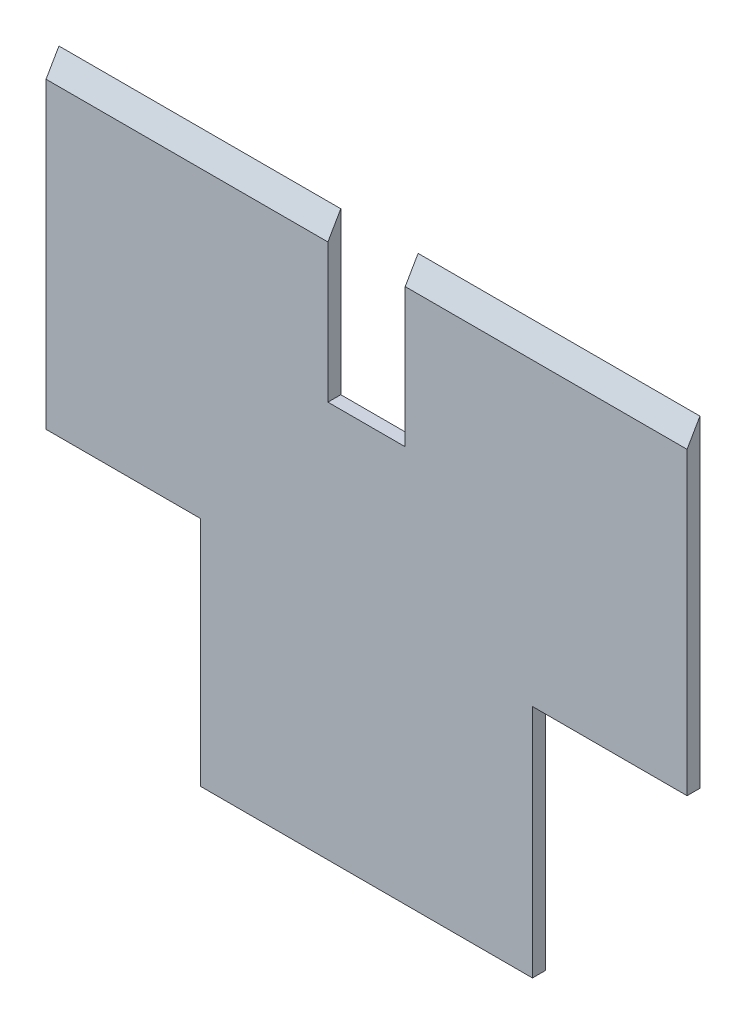
ISO-10303-21;
HEADER;
FILE_DESCRIPTION(('STEP AP214'),'2;1');
FILE_NAME('part.step','',(''),(''),'','','');
FILE_SCHEMA(('AUTOMOTIVE_DESIGN { 1 0 10303 214 1 1 1 1 }'));
ENDSEC;
DATA;
#1=APPLICATION_CONTEXT('core data for automotive mechanical design processes');
#2=APPLICATION_PROTOCOL_DEFINITION('international standard','automotive_design',2000,#1);
#3=PRODUCT_CONTEXT('',#1,'mechanical');
#4=PRODUCT('Part','Part','',(#3));
#5=PRODUCT_RELATED_PRODUCT_CATEGORY('part','',(#4));
#6=PRODUCT_DEFINITION_FORMATION('','',#4);
#7=PRODUCT_DEFINITION_CONTEXT('part definition',#1,'design');
#8=PRODUCT_DEFINITION('design','',#6,#7);
#9=PRODUCT_DEFINITION_SHAPE('','',#8);
#10=(LENGTH_UNIT() NAMED_UNIT(*) SI_UNIT(.MILLI.,.METRE.));
#11=(NAMED_UNIT(*) PLANE_ANGLE_UNIT() SI_UNIT($,.RADIAN.));
#12=(NAMED_UNIT(*) SI_UNIT($,.STERADIAN.) SOLID_ANGLE_UNIT());
#13=UNCERTAINTY_MEASURE_WITH_UNIT(LENGTH_MEASURE(1.E-05),#10,'distance_accuracy_value','');
#14=(GEOMETRIC_REPRESENTATION_CONTEXT(3) GLOBAL_UNCERTAINTY_ASSIGNED_CONTEXT((#13)) GLOBAL_UNIT_ASSIGNED_CONTEXT((#10,
#11,#12)) REPRESENTATION_CONTEXT('',''));
#15=CARTESIAN_POINT('',(0.,0.,0.));
#16=DIRECTION('',(0.,0.,1.));
#17=DIRECTION('',(1.,0.,0.));
#18=AXIS2_PLACEMENT_3D('',#15,#16,#17);
#19=CARTESIAN_POINT('',(100.,92.5322225306928,0.));
#20=DIRECTION('',(0.,-0.499722453506971,-0.866185586038566));
#21=DIRECTION('',(0.,0.866185586038566,-0.499722453506971));
#22=AXIS2_PLACEMENT_3D('',#19,#20,#21);
#23=PLANE('',#22);
#24=DIRECTION('',(-1.,0.,0.));
#25=VECTOR('',#24,1.);
#26=CARTESIAN_POINT('',(100.,89.065555864187,2.));
#27=LINE('',#26,#25);
#28=CARTESIAN_POINT('',(43.75,89.065555864187,2.));
#29=VERTEX_POINT('',#28);
#30=CARTESIAN_POINT('',(0.,89.065555864187,2.));
#31=VERTEX_POINT('',#30);
#32=EDGE_CURVE('E175',#29,#31,#27,.T.);
#33=ORIENTED_EDGE('',*,*,#32,.F.);
#34=DIRECTION('',(0.,0.866185586038566,-0.499722453506971));
#35=VECTOR('',#34,1.);
#36=CARTESIAN_POINT('',(43.75,92.5322225306928,0.));
#37=LINE('',#36,#35);
#38=CARTESIAN_POINT('',(43.75,92.5322225306928,0.));
#39=VERTEX_POINT('',#38);
#40=EDGE_CURVE('E11',#29,#39,#37,.T.);
#41=ORIENTED_EDGE('',*,*,#40,.T.);
#42=DIRECTION('',(-1.,0.,0.));
#43=VECTOR('',#42,1.);
#44=CARTESIAN_POINT('',(100.,92.5322225306928,0.));
#45=LINE('',#44,#43);
#46=CARTESIAN_POINT('',(0.,92.5322225306928,0.));
#47=VERTEX_POINT('',#46);
#48=EDGE_CURVE('E181',#39,#47,#45,.T.);
#49=ORIENTED_EDGE('',*,*,#48,.T.);
#50=DIRECTION('',(0.,-0.866185586038566,0.499722453506971));
#51=VECTOR('',#50,1.);
#52=CARTESIAN_POINT('',(0.,92.5322225306928,0.));
#53=LINE('',#52,#51);
#54=EDGE_CURVE('E179',#47,#31,#53,.T.);
#55=ORIENTED_EDGE('',*,*,#54,.T.);
#56=EDGE_LOOP('',(#33,#41,#49,#55));
#57=FACE_BOUND('',#56,.T.);
#58=ADVANCED_FACE('F32',(#57),#23,.F.);
#59=CARTESIAN_POINT('',(0.,42.,2.));
#60=DIRECTION('',(1.,0.,0.));
#61=DIRECTION('',(0.,0.,-1.));
#62=AXIS2_PLACEMENT_3D('',#59,#60,#61);
#63=PLANE('',#62);
#64=DIRECTION('',(0.,-1.,0.));
#65=VECTOR('',#64,1.);
#66=CARTESIAN_POINT('',(0.,42.,2.));
#67=LINE('',#66,#65);
#68=CARTESIAN_POINT('',(0.,42.,2.));
#69=VERTEX_POINT('',#68);
#70=EDGE_CURVE('E142',#31,#69,#67,.T.);
#71=ORIENTED_EDGE('',*,*,#70,.F.);
#72=ORIENTED_EDGE('',*,*,#54,.F.);
#73=DIRECTION('',(0.,-1.,0.));
#74=VECTOR('',#73,1.);
#75=CARTESIAN_POINT('',(0.,42.,0.));
#76=LINE('',#75,#74);
#77=CARTESIAN_POINT('',(0.,42.,0.));
#78=VERTEX_POINT('',#77);
#79=EDGE_CURVE('E147',#47,#78,#76,.T.);
#80=ORIENTED_EDGE('',*,*,#79,.T.);
#81=DIRECTION('',(0.,0.,-1.));
#82=VECTOR('',#81,1.);
#83=CARTESIAN_POINT('',(0.,42.,2.));
#84=LINE('',#83,#82);
#85=EDGE_CURVE('E152',#69,#78,#84,.T.);
#86=ORIENTED_EDGE('',*,*,#85,.F.);
#87=EDGE_LOOP('',(#71,#72,#80,#86));
#88=FACE_BOUND('',#87,.T.);
#89=ADVANCED_FACE('F34',(#88),#63,.F.);
#90=CARTESIAN_POINT('',(24.,42.,2.));
#91=DIRECTION('',(0.,1.,0.));
#92=DIRECTION('',(0.,0.,1.));
#93=AXIS2_PLACEMENT_3D('',#90,#91,#92);
#94=PLANE('',#93);
#95=DIRECTION('',(1.,0.,0.));
#96=VECTOR('',#95,1.);
#97=CARTESIAN_POINT('',(24.,42.,0.));
#98=LINE('',#97,#96);
#99=CARTESIAN_POINT('',(24.,42.,0.));
#100=VERTEX_POINT('',#99);
#101=EDGE_CURVE('E143',#78,#100,#98,.T.);
#102=ORIENTED_EDGE('',*,*,#101,.T.);
#103=DIRECTION('',(0.,0.,-1.));
#104=VECTOR('',#103,1.);
#105=CARTESIAN_POINT('',(24.,42.,2.));
#106=LINE('',#105,#104);
#107=CARTESIAN_POINT('',(24.,42.,2.));
#108=VERTEX_POINT('',#107);
#109=EDGE_CURVE('E141',#108,#100,#106,.T.);
#110=ORIENTED_EDGE('',*,*,#109,.F.);
#111=DIRECTION('',(1.,0.,0.));
#112=VECTOR('',#111,1.);
#113=CARTESIAN_POINT('',(24.,42.,2.));
#114=LINE('',#113,#112);
#115=EDGE_CURVE('E145',#69,#108,#114,.T.);
#116=ORIENTED_EDGE('',*,*,#115,.F.);
#117=ORIENTED_EDGE('',*,*,#85,.T.);
#118=EDGE_LOOP('',(#102,#110,#116,#117));
#119=FACE_BOUND('',#118,.T.);
#120=ADVANCED_FACE('F189',(#119),#94,.F.);
#121=CARTESIAN_POINT('',(24.,42.,2.));
#122=DIRECTION('',(1.,0.,0.));
#123=DIRECTION('',(0.,0.,-1.));
#124=AXIS2_PLACEMENT_3D('',#121,#122,#123);
#125=PLANE('',#124);
#126=DIRECTION('',(0.,-1.,0.));
#127=VECTOR('',#126,1.);
#128=CARTESIAN_POINT('',(24.,42.,0.));
#129=LINE('',#128,#127);
#130=CARTESIAN_POINT('',(24.,5.99999999999999,0.));
#131=VERTEX_POINT('',#130);
#132=EDGE_CURVE('E134',#100,#131,#129,.T.);
#133=ORIENTED_EDGE('',*,*,#132,.T.);
#134=DIRECTION('',(0.,0.,1.));
#135=VECTOR('',#134,1.);
#136=CARTESIAN_POINT('',(24.,5.99999999999999,0.));
#137=LINE('',#136,#135);
#138=CARTESIAN_POINT('',(24.,5.99999999999999,2.));
#139=VERTEX_POINT('',#138);
#140=EDGE_CURVE('E119',#131,#139,#137,.T.);
#141=ORIENTED_EDGE('',*,*,#140,.T.);
#142=DIRECTION('',(0.,-1.,0.));
#143=VECTOR('',#142,1.);
#144=CARTESIAN_POINT('',(24.,42.,2.));
#145=LINE('',#144,#143);
#146=EDGE_CURVE('E153',#108,#139,#145,.T.);
#147=ORIENTED_EDGE('',*,*,#146,.F.);
#148=ORIENTED_EDGE('',*,*,#109,.T.);
#149=EDGE_LOOP('',(#133,#141,#147,#148));
#150=FACE_BOUND('',#149,.T.);
#151=ADVANCED_FACE('F139',(#150),#125,.F.);
#152=CARTESIAN_POINT('',(0.,0.,2.));
#153=DIRECTION('',(0.,0.,-1.));
#154=DIRECTION('',(-1.,0.,0.));
#155=AXIS2_PLACEMENT_3D('',#152,#153,#154);
#156=PLANE('',#155);
#157=ORIENTED_EDGE('',*,*,#146,.T.);
#158=DIRECTION('',(1.,0.,0.));
#159=VECTOR('',#158,1.);
#160=CARTESIAN_POINT('',(24.,5.99999999999999,2.));
#161=LINE('',#160,#159);
#162=CARTESIAN_POINT('',(75.5028366048789,5.99999999999999,2.));
#163=VERTEX_POINT('',#162);
#164=EDGE_CURVE('E122',#139,#163,#161,.T.);
#165=ORIENTED_EDGE('',*,*,#164,.T.);
#166=DIRECTION('',(0.,1.,0.));
#167=VECTOR('',#166,1.);
#168=CARTESIAN_POINT('',(75.5028366048789,0.,2.));
#169=LINE('',#168,#167);
#170=CARTESIAN_POINT('',(75.5028366048789,42.5,2.));
#171=VERTEX_POINT('',#170);
#172=EDGE_CURVE('E207',#163,#171,#169,.T.);
#173=ORIENTED_EDGE('',*,*,#172,.T.);
#174=DIRECTION('',(1.,0.,0.));
#175=VECTOR('',#174,1.);
#176=CARTESIAN_POINT('',(75.5028366048789,42.5,2.));
#177=LINE('',#176,#175);
#178=CARTESIAN_POINT('',(99.5,42.5,2.));
#179=VERTEX_POINT('',#178);
#180=EDGE_CURVE('E213',#171,#179,#177,.T.);
#181=ORIENTED_EDGE('',*,*,#180,.T.);
#182=DIRECTION('',(0.,1.,0.));
#183=VECTOR('',#182,1.);
#184=CARTESIAN_POINT('',(99.5,92.5322225306928,2.));
#185=LINE('',#184,#183);
#186=CARTESIAN_POINT('',(99.5,89.065555864187,2.));
#187=VERTEX_POINT('',#186);
#188=EDGE_CURVE('E174',#179,#187,#185,.T.);
#189=ORIENTED_EDGE('',*,*,#188,.T.);
#190=CARTESIAN_POINT('',(55.75,89.065555864187,2.));
#191=VERTEX_POINT('',#190);
#192=EDGE_CURVE('E163',#187,#191,#27,.T.);
#193=ORIENTED_EDGE('',*,*,#192,.T.);
#194=DIRECTION('',(0.,-1.,0.));
#195=VECTOR('',#194,1.);
#196=CARTESIAN_POINT('',(55.75,67.5322225306928,2.));
#197=LINE('',#196,#195);
#198=CARTESIAN_POINT('',(55.75,67.5322225306928,2.));
#199=VERTEX_POINT('',#198);
#200=EDGE_CURVE('E55',#191,#199,#197,.T.);
#201=ORIENTED_EDGE('',*,*,#200,.T.);
#202=DIRECTION('',(-1.,0.,0.));
#203=VECTOR('',#202,1.);
#204=CARTESIAN_POINT('',(55.75,67.5322225306928,2.));
#205=LINE('',#204,#203);
#206=CARTESIAN_POINT('',(43.75,67.5322225306928,2.));
#207=VERTEX_POINT('',#206);
#208=EDGE_CURVE('E218',#199,#207,#205,.T.);
#209=ORIENTED_EDGE('',*,*,#208,.T.);
#210=DIRECTION('',(0.,1.,0.));
#211=VECTOR('',#210,1.);
#212=CARTESIAN_POINT('',(43.75,67.5322225306928,2.));
#213=LINE('',#212,#211);
#214=EDGE_CURVE('E223',#207,#29,#213,.T.);
#215=ORIENTED_EDGE('',*,*,#214,.T.);
#216=ORIENTED_EDGE('',*,*,#32,.T.);
#217=ORIENTED_EDGE('',*,*,#70,.T.);
#218=ORIENTED_EDGE('',*,*,#115,.T.);
#219=EDGE_LOOP('',(#157,#165,#173,#181,#189,#193,#201,#209,#215,#216,#217,#218));
#220=FACE_BOUND('',#219,.T.);
#221=ADVANCED_FACE('F170',(#220),#156,.F.);
#222=CARTESIAN_POINT('',(0.,0.,0.));
#223=DIRECTION('',(0.,0.,-1.));
#224=DIRECTION('',(-1.,0.,0.));
#225=AXIS2_PLACEMENT_3D('',#222,#223,#224);
#226=PLANE('',#225);
#227=DIRECTION('',(1.,0.,0.));
#228=VECTOR('',#227,1.);
#229=CARTESIAN_POINT('',(24.,5.99999999999999,0.));
#230=LINE('',#229,#228);
#231=CARTESIAN_POINT('',(75.5028366048789,5.99999999999999,0.));
#232=VERTEX_POINT('',#231);
#233=EDGE_CURVE('E47',#131,#232,#230,.T.);
#234=ORIENTED_EDGE('',*,*,#233,.F.);
#235=ORIENTED_EDGE('',*,*,#132,.F.);
#236=ORIENTED_EDGE('',*,*,#101,.F.);
#237=ORIENTED_EDGE('',*,*,#79,.F.);
#238=ORIENTED_EDGE('',*,*,#48,.F.);
#239=DIRECTION('',(0.,1.,0.));
#240=VECTOR('',#239,1.);
#241=CARTESIAN_POINT('',(43.75,67.5322225306928,0.));
#242=LINE('',#241,#240);
#243=CARTESIAN_POINT('',(43.75,67.5322225306928,0.));
#244=VERTEX_POINT('',#243);
#245=EDGE_CURVE('E226',#244,#39,#242,.T.);
#246=ORIENTED_EDGE('',*,*,#245,.F.);
#247=DIRECTION('',(-1.,0.,0.));
#248=VECTOR('',#247,1.);
#249=CARTESIAN_POINT('',(55.75,67.5322225306928,0.));
#250=LINE('',#249,#248);
#251=CARTESIAN_POINT('',(55.75,67.5322225306928,0.));
#252=VERTEX_POINT('',#251);
#253=EDGE_CURVE('E220',#252,#244,#250,.T.);
#254=ORIENTED_EDGE('',*,*,#253,.F.);
#255=DIRECTION('',(0.,-1.,0.));
#256=VECTOR('',#255,1.);
#257=CARTESIAN_POINT('',(55.75,67.5322225306928,0.));
#258=LINE('',#257,#256);
#259=CARTESIAN_POINT('',(55.75,92.5322225306928,0.));
#260=VERTEX_POINT('',#259);
#261=EDGE_CURVE('E224',#260,#252,#258,.T.);
#262=ORIENTED_EDGE('',*,*,#261,.F.);
#263=CARTESIAN_POINT('',(99.5,92.5322225306928,0.));
#264=VERTEX_POINT('',#263);
#265=EDGE_CURVE('E165',#264,#260,#45,.T.);
#266=ORIENTED_EDGE('',*,*,#265,.F.);
#267=DIRECTION('',(0.,1.,0.));
#268=VECTOR('',#267,1.);
#269=CARTESIAN_POINT('',(99.5,92.5322225306928,0.));
#270=LINE('',#269,#268);
#271=CARTESIAN_POINT('',(99.5,42.5,0.));
#272=VERTEX_POINT('',#271);
#273=EDGE_CURVE('E205',#272,#264,#270,.T.);
#274=ORIENTED_EDGE('',*,*,#273,.F.);
#275=DIRECTION('',(1.,0.,0.));
#276=VECTOR('',#275,1.);
#277=CARTESIAN_POINT('',(75.5028366048789,42.5,0.));
#278=LINE('',#277,#276);
#279=CARTESIAN_POINT('',(75.5028366048789,42.5,0.));
#280=VERTEX_POINT('',#279);
#281=EDGE_CURVE('E208',#280,#272,#278,.T.);
#282=ORIENTED_EDGE('',*,*,#281,.F.);
#283=DIRECTION('',(0.,1.,0.));
#284=VECTOR('',#283,1.);
#285=CARTESIAN_POINT('',(75.5028366048789,0.,0.));
#286=LINE('',#285,#284);
#287=EDGE_CURVE('E136',#232,#280,#286,.T.);
#288=ORIENTED_EDGE('',*,*,#287,.F.);
#289=EDGE_LOOP('',(#234,#235,#236,#237,#238,#246,#254,#262,#266,#274,#282,#288));
#290=FACE_BOUND('',#289,.T.);
#291=ADVANCED_FACE('F132',(#290),#226,.T.);
#292=ORIENTED_EDGE('',*,*,#265,.T.);
#293=DIRECTION('',(0.,-0.866185586038566,0.499722453506971));
#294=VECTOR('',#293,1.);
#295=CARTESIAN_POINT('',(55.75,92.5322225306928,0.));
#296=LINE('',#295,#294);
#297=EDGE_CURVE('E40',#260,#191,#296,.T.);
#298=ORIENTED_EDGE('',*,*,#297,.T.);
#299=ORIENTED_EDGE('',*,*,#192,.F.);
#300=DIRECTION('',(0.,0.866185586038566,-0.499722453506971));
#301=VECTOR('',#300,1.);
#302=CARTESIAN_POINT('',(99.5,92.5322225306928,0.));
#303=LINE('',#302,#301);
#304=EDGE_CURVE('E156',#187,#264,#303,.T.);
#305=ORIENTED_EDGE('',*,*,#304,.T.);
#306=EDGE_LOOP('',(#292,#298,#299,#305));
#307=FACE_BOUND('',#306,.T.);
#308=ADVANCED_FACE('F162',(#307),#23,.F.);
#309=CARTESIAN_POINT('',(99.5,92.5322225306928,2.));
#310=DIRECTION('',(-1.,0.,0.));
#311=DIRECTION('',(0.,0.,1.));
#312=AXIS2_PLACEMENT_3D('',#309,#310,#311);
#313=PLANE('',#312);
#314=ORIENTED_EDGE('',*,*,#188,.F.);
#315=DIRECTION('',(0.,0.,-1.));
#316=VECTOR('',#315,1.);
#317=CARTESIAN_POINT('',(99.5,42.5,2.));
#318=LINE('',#317,#316);
#319=EDGE_CURVE('E198',#179,#272,#318,.T.);
#320=ORIENTED_EDGE('',*,*,#319,.T.);
#321=ORIENTED_EDGE('',*,*,#273,.T.);
#322=ORIENTED_EDGE('',*,*,#304,.F.);
#323=EDGE_LOOP('',(#314,#320,#321,#322));
#324=FACE_BOUND('',#323,.T.);
#325=ADVANCED_FACE('F240',(#324),#313,.F.);
#326=CARTESIAN_POINT('',(75.5028366048789,42.5,2.));
#327=DIRECTION('',(0.,1.,0.));
#328=DIRECTION('',(0.,0.,1.));
#329=AXIS2_PLACEMENT_3D('',#326,#327,#328);
#330=PLANE('',#329);
#331=ORIENTED_EDGE('',*,*,#281,.T.);
#332=ORIENTED_EDGE('',*,*,#319,.F.);
#333=ORIENTED_EDGE('',*,*,#180,.F.);
#334=DIRECTION('',(0.,0.,-1.));
#335=VECTOR('',#334,1.);
#336=CARTESIAN_POINT('',(75.5028366048789,42.5,2.));
#337=LINE('',#336,#335);
#338=EDGE_CURVE('E199',#171,#280,#337,.T.);
#339=ORIENTED_EDGE('',*,*,#338,.T.);
#340=EDGE_LOOP('',(#331,#332,#333,#339));
#341=FACE_BOUND('',#340,.T.);
#342=ADVANCED_FACE('F238',(#341),#330,.F.);
#343=CARTESIAN_POINT('',(75.5028366048789,0.,2.));
#344=DIRECTION('',(-1.,0.,0.));
#345=DIRECTION('',(0.,0.,1.));
#346=AXIS2_PLACEMENT_3D('',#343,#344,#345);
#347=PLANE('',#346);
#348=ORIENTED_EDGE('',*,*,#172,.F.);
#349=DIRECTION('',(0.,0.,1.));
#350=VECTOR('',#349,1.);
#351=CARTESIAN_POINT('',(75.5028366048789,5.99999999999999,0.));
#352=LINE('',#351,#350);
#353=EDGE_CURVE('E127',#232,#163,#352,.T.);
#354=ORIENTED_EDGE('',*,*,#353,.F.);
#355=ORIENTED_EDGE('',*,*,#287,.T.);
#356=ORIENTED_EDGE('',*,*,#338,.F.);
#357=EDGE_LOOP('',(#348,#354,#355,#356));
#358=FACE_BOUND('',#357,.T.);
#359=ADVANCED_FACE('F234',(#358),#347,.F.);
#360=CARTESIAN_POINT('',(43.75,67.5322225306928,2.));
#361=DIRECTION('',(-1.,0.,0.));
#362=DIRECTION('',(0.,0.,1.));
#363=AXIS2_PLACEMENT_3D('',#360,#361,#362);
#364=PLANE('',#363);
#365=ORIENTED_EDGE('',*,*,#214,.F.);
#366=DIRECTION('',(0.,0.,-1.));
#367=VECTOR('',#366,1.);
#368=CARTESIAN_POINT('',(43.75,67.5322225306928,2.));
#369=LINE('',#368,#367);
#370=EDGE_CURVE('E211',#207,#244,#369,.T.);
#371=ORIENTED_EDGE('',*,*,#370,.T.);
#372=ORIENTED_EDGE('',*,*,#245,.T.);
#373=ORIENTED_EDGE('',*,*,#40,.F.);
#374=EDGE_LOOP('',(#365,#371,#372,#373));
#375=FACE_BOUND('',#374,.T.);
#376=ADVANCED_FACE('F248',(#375),#364,.F.);
#377=CARTESIAN_POINT('',(55.75,67.5322225306928,2.));
#378=DIRECTION('',(1.,0.,0.));
#379=DIRECTION('',(0.,0.,-1.));
#380=AXIS2_PLACEMENT_3D('',#377,#378,#379);
#381=PLANE('',#380);
#382=ORIENTED_EDGE('',*,*,#261,.T.);
#383=DIRECTION('',(0.,0.,-1.));
#384=VECTOR('',#383,1.);
#385=CARTESIAN_POINT('',(55.75,67.5322225306928,2.));
#386=LINE('',#385,#384);
#387=EDGE_CURVE('E216',#199,#252,#386,.T.);
#388=ORIENTED_EDGE('',*,*,#387,.F.);
#389=ORIENTED_EDGE('',*,*,#200,.F.);
#390=ORIENTED_EDGE('',*,*,#297,.F.);
#391=EDGE_LOOP('',(#382,#388,#389,#390));
#392=FACE_BOUND('',#391,.T.);
#393=ADVANCED_FACE('F242',(#392),#381,.F.);
#394=CARTESIAN_POINT('',(55.75,67.5322225306928,2.));
#395=DIRECTION('',(0.,-1.,0.));
#396=DIRECTION('',(0.,0.,-1.));
#397=AXIS2_PLACEMENT_3D('',#394,#395,#396);
#398=PLANE('',#397);
#399=ORIENTED_EDGE('',*,*,#253,.T.);
#400=ORIENTED_EDGE('',*,*,#370,.F.);
#401=ORIENTED_EDGE('',*,*,#208,.F.);
#402=ORIENTED_EDGE('',*,*,#387,.T.);
#403=EDGE_LOOP('',(#399,#400,#401,#402));
#404=FACE_BOUND('',#403,.T.);
#405=ADVANCED_FACE('F245',(#404),#398,.F.);
#406=CARTESIAN_POINT('',(24.,5.99999999999999,0.));
#407=DIRECTION('',(0.,1.,0.));
#408=DIRECTION('',(0.,0.,1.));
#409=AXIS2_PLACEMENT_3D('',#406,#407,#408);
#410=PLANE('',#409);
#411=ORIENTED_EDGE('',*,*,#353,.T.);
#412=ORIENTED_EDGE('',*,*,#164,.F.);
#413=ORIENTED_EDGE('',*,*,#140,.F.);
#414=ORIENTED_EDGE('',*,*,#233,.T.);
#415=EDGE_LOOP('',(#411,#412,#413,#414));
#416=FACE_BOUND('',#415,.T.);
#417=ADVANCED_FACE('F120',(#416),#410,.F.);
#418=CLOSED_SHELL('',(#58,#89,#120,#151,#221,#291,#308,#325,#342,#359,#376,#393,#405,#417));
#419=MANIFOLD_SOLID_BREP('B2',#418);
#420=ADVANCED_BREP_SHAPE_REPRESENTATION('',(#18,#419),#14);
#421=SHAPE_DEFINITION_REPRESENTATION(#9,#420);
ENDSEC;
END-ISO-10303-21;
